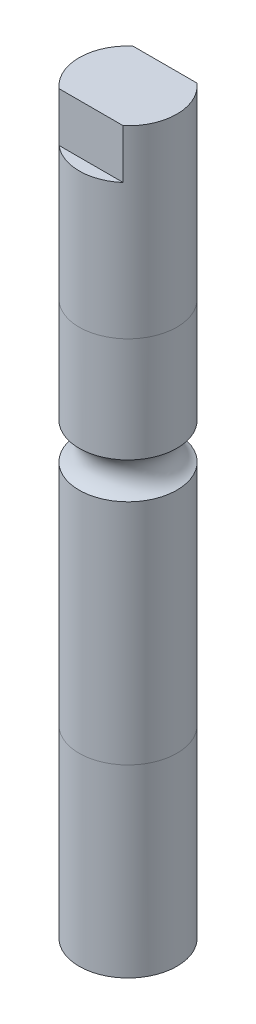
ISO-10303-21;
HEADER;
FILE_DESCRIPTION(('STEP AP214'),'2;1');
FILE_NAME('part.step','',(''),(''),'','','');
FILE_SCHEMA(('AUTOMOTIVE_DESIGN { 1 0 10303 214 1 1 1 1 }'));
ENDSEC;
DATA;
#1=APPLICATION_CONTEXT('core data for automotive mechanical design processes');
#2=APPLICATION_PROTOCOL_DEFINITION('international standard','automotive_design',2000,#1);
#3=PRODUCT_CONTEXT('',#1,'mechanical');
#4=PRODUCT('Part','Part','',(#3));
#5=PRODUCT_RELATED_PRODUCT_CATEGORY('part','',(#4));
#6=PRODUCT_DEFINITION_FORMATION('','',#4);
#7=PRODUCT_DEFINITION_CONTEXT('part definition',#1,'design');
#8=PRODUCT_DEFINITION('design','',#6,#7);
#9=PRODUCT_DEFINITION_SHAPE('','',#8);
#10=(LENGTH_UNIT() NAMED_UNIT(*) SI_UNIT(.MILLI.,.METRE.));
#11=(NAMED_UNIT(*) PLANE_ANGLE_UNIT() SI_UNIT($,.RADIAN.));
#12=(NAMED_UNIT(*) SI_UNIT($,.STERADIAN.) SOLID_ANGLE_UNIT());
#13=UNCERTAINTY_MEASURE_WITH_UNIT(LENGTH_MEASURE(1.E-05),#10,'distance_accuracy_value','');
#14=(GEOMETRIC_REPRESENTATION_CONTEXT(3) GLOBAL_UNCERTAINTY_ASSIGNED_CONTEXT((#13)) GLOBAL_UNIT_ASSIGNED_CONTEXT((#10,
#11,#12)) REPRESENTATION_CONTEXT('',''));
#15=CARTESIAN_POINT('',(0.,0.,0.));
#16=DIRECTION('',(0.,0.,1.));
#17=DIRECTION('',(1.,0.,0.));
#18=AXIS2_PLACEMENT_3D('',#15,#16,#17);
#19=CARTESIAN_POINT('',(0.,60.,0.));
#20=DIRECTION('',(0.,-1.,0.));
#21=DIRECTION('',(0.,0.,-1.));
#22=AXIS2_PLACEMENT_3D('',#19,#20,#21);
#23=CYLINDRICAL_SURFACE('',#22,3.975);
#24=CARTESIAN_POINT('',(0.,33.5271201678345,0.));
#25=DIRECTION('',(0.,-1.,0.));
#26=DIRECTION('',(0.,0.,-1.));
#27=AXIS2_PLACEMENT_3D('',#24,#25,#26);
#28=CIRCLE('',#27,3.975);
#29=CARTESIAN_POINT('',(0.,33.5271201678345,-3.975));
#30=VERTEX_POINT('',#29);
#31=EDGE_CURVE('E113',#30,#30,#28,.T.);
#32=ORIENTED_EDGE('',*,*,#31,.T.);
#33=EDGE_LOOP('',(#32));
#34=FACE_BOUND('',#33,.T.);
#35=CARTESIAN_POINT('',(0.,15.,0.));
#36=DIRECTION('',(0.,-1.,0.));
#37=DIRECTION('',(0.,0.,-1.));
#38=AXIS2_PLACEMENT_3D('',#35,#36,#37);
#39=CIRCLE('',#38,3.975);
#40=CARTESIAN_POINT('',(0.,15.,-3.975));
#41=VERTEX_POINT('',#40);
#42=EDGE_CURVE('E12',#41,#41,#39,.T.);
#43=ORIENTED_EDGE('',*,*,#42,.F.);
#44=EDGE_LOOP('',(#43));
#45=FACE_BOUND('',#44,.T.);
#46=ADVANCED_FACE('F39',(#34,#45),#23,.T.);
#47=CARTESIAN_POINT('',(0.,0.,0.));
#48=DIRECTION('',(0.,1.,0.));
#49=DIRECTION('',(0.,0.,1.));
#50=AXIS2_PLACEMENT_3D('',#47,#48,#49);
#51=CIRCLE('',#50,3.975);
#52=CARTESIAN_POINT('',(0.,0.,3.975));
#53=VERTEX_POINT('',#52);
#54=EDGE_CURVE('E116',#53,#53,#51,.T.);
#55=ORIENTED_EDGE('',*,*,#54,.T.);
#56=EDGE_LOOP('',(#55));
#57=FACE_BOUND('',#56,.T.);
#58=ORIENTED_EDGE('',*,*,#42,.T.);
#59=EDGE_LOOP('',(#58));
#60=FACE_BOUND('',#59,.T.);
#61=ADVANCED_FACE('F135',(#57,#60),#23,.T.);
#62=CARTESIAN_POINT('',(0.,0.,0.));
#63=DIRECTION('',(0.,1.,0.));
#64=DIRECTION('',(0.,0.,1.));
#65=AXIS2_PLACEMENT_3D('',#62,#63,#64);
#66=PLANE('',#65);
#67=ORIENTED_EDGE('',*,*,#54,.F.);
#68=EDGE_LOOP('',(#67));
#69=FACE_BOUND('',#68,.T.);
#70=ADVANCED_FACE('F142',(#69),#66,.F.);
#71=CARTESIAN_POINT('',(0.,35.,0.));
#72=DIRECTION('',(0.,-1.,0.));
#73=DIRECTION('',(0.,0.,-1.));
#74=AXIS2_PLACEMENT_3D('',#71,#72,#73);
#75=TOROIDAL_SURFACE('',#74,4.6,1.6);
#76=ORIENTED_EDGE('',*,*,#31,.F.);
#77=EDGE_LOOP('',(#76));
#78=FACE_BOUND('',#77,.T.);
#79=CARTESIAN_POINT('',(0.,36.4728798321655,0.));
#80=DIRECTION('',(0.,-1.,0.));
#81=DIRECTION('',(0.,0.,-1.));
#82=AXIS2_PLACEMENT_3D('',#79,#80,#81);
#83=CIRCLE('',#82,3.975);
#84=CARTESIAN_POINT('',(0.,36.4728798321655,-3.975));
#85=VERTEX_POINT('',#84);
#86=EDGE_CURVE('E109',#85,#85,#83,.T.);
#87=ORIENTED_EDGE('',*,*,#86,.T.);
#88=EDGE_LOOP('',(#87));
#89=FACE_BOUND('',#88,.T.);
#90=ADVANCED_FACE('F149',(#78,#89),#75,.F.);
#91=CARTESIAN_POINT('',(0.,60.,0.));
#92=DIRECTION('',(0.,1.,0.));
#93=DIRECTION('',(0.,0.,1.));
#94=AXIS2_PLACEMENT_3D('',#91,#92,#93);
#95=PLANE('',#94);
#96=DIRECTION('',(-1.,0.,0.));
#97=VECTOR('',#96,1.);
#98=CARTESIAN_POINT('',(-2.60780079760706,60.,3.));
#99=LINE('',#98,#97);
#100=CARTESIAN_POINT('',(2.60780079760706,60.,3.));
#101=VERTEX_POINT('',#100);
#102=CARTESIAN_POINT('',(-2.60780079760706,60.,3.));
#103=VERTEX_POINT('',#102);
#104=EDGE_CURVE('E83',#101,#103,#99,.T.);
#105=ORIENTED_EDGE('',*,*,#104,.F.);
#106=CARTESIAN_POINT('',(0.,60.,0.));
#107=DIRECTION('',(0.,1.,0.));
#108=DIRECTION('',(0.,0.,1.));
#109=AXIS2_PLACEMENT_3D('',#106,#107,#108);
#110=CIRCLE('',#109,3.975);
#111=CARTESIAN_POINT('',(2.60780079760706,60.,-3.));
#112=VERTEX_POINT('',#111);
#113=EDGE_CURVE('E95',#101,#112,#110,.T.);
#114=ORIENTED_EDGE('',*,*,#113,.T.);
#115=DIRECTION('',(1.,0.,0.));
#116=VECTOR('',#115,1.);
#117=CARTESIAN_POINT('',(-2.60780079760706,60.,-3.));
#118=LINE('',#117,#116);
#119=CARTESIAN_POINT('',(-2.60780079760706,60.,-3.));
#120=VERTEX_POINT('',#119);
#121=EDGE_CURVE('E97',#120,#112,#118,.T.);
#122=ORIENTED_EDGE('',*,*,#121,.F.);
#123=EDGE_CURVE('E117',#120,#103,#110,.T.);
#124=ORIENTED_EDGE('',*,*,#123,.T.);
#125=EDGE_LOOP('',(#105,#114,#122,#124));
#126=FACE_BOUND('',#125,.T.);
#127=ADVANCED_FACE('F134',(#126),#95,.T.);
#128=ORIENTED_EDGE('',*,*,#113,.F.);
#129=DIRECTION('',(0.,1.,0.));
#130=VECTOR('',#129,1.);
#131=CARTESIAN_POINT('',(2.60780079760706,56.,3.));
#132=LINE('',#131,#130);
#133=CARTESIAN_POINT('',(2.60780079760706,56.,3.));
#134=VERTEX_POINT('',#133);
#135=EDGE_CURVE('E87',#134,#101,#132,.T.);
#136=ORIENTED_EDGE('',*,*,#135,.F.);
#137=CARTESIAN_POINT('',(0.,56.,0.));
#138=DIRECTION('',(0.,1.,0.));
#139=DIRECTION('',(0.,0.,1.));
#140=AXIS2_PLACEMENT_3D('',#137,#138,#139);
#141=CIRCLE('',#140,3.975);
#142=CARTESIAN_POINT('',(-2.60780079760706,56.,3.));
#143=VERTEX_POINT('',#142);
#144=EDGE_CURVE('E78',#143,#134,#141,.T.);
#145=ORIENTED_EDGE('',*,*,#144,.F.);
#146=DIRECTION('',(0.,1.,0.));
#147=VECTOR('',#146,1.);
#148=CARTESIAN_POINT('',(-2.60780079760706,56.,3.));
#149=LINE('',#148,#147);
#150=EDGE_CURVE('E89',#143,#103,#149,.T.);
#151=ORIENTED_EDGE('',*,*,#150,.T.);
#152=ORIENTED_EDGE('',*,*,#123,.F.);
#153=DIRECTION('',(0.,1.,0.));
#154=VECTOR('',#153,1.);
#155=CARTESIAN_POINT('',(-2.60780079760706,56.,-3.));
#156=LINE('',#155,#154);
#157=CARTESIAN_POINT('',(-2.60780079760706,56.,-3.));
#158=VERTEX_POINT('',#157);
#159=EDGE_CURVE('E104',#158,#120,#156,.T.);
#160=ORIENTED_EDGE('',*,*,#159,.F.);
#161=CARTESIAN_POINT('',(0.,56.,0.));
#162=DIRECTION('',(0.,1.,0.));
#163=DIRECTION('',(0.,0.,1.));
#164=AXIS2_PLACEMENT_3D('',#161,#162,#163);
#165=CIRCLE('',#164,3.975);
#166=CARTESIAN_POINT('',(2.60780079760706,56.,-3.));
#167=VERTEX_POINT('',#166);
#168=EDGE_CURVE('E101',#167,#158,#165,.T.);
#169=ORIENTED_EDGE('',*,*,#168,.F.);
#170=DIRECTION('',(0.,1.,0.));
#171=VECTOR('',#170,1.);
#172=CARTESIAN_POINT('',(2.60780079760706,56.,-3.));
#173=LINE('',#172,#171);
#174=EDGE_CURVE('E107',#167,#112,#173,.T.);
#175=ORIENTED_EDGE('',*,*,#174,.T.);
#176=EDGE_LOOP('',(#128,#136,#145,#151,#152,#160,#169,#175));
#177=FACE_BOUND('',#176,.T.);
#178=CARTESIAN_POINT('',(0.,45.,0.));
#179=DIRECTION('',(0.,1.,0.));
#180=DIRECTION('',(0.,0.,1.));
#181=AXIS2_PLACEMENT_3D('',#178,#179,#180);
#182=CIRCLE('',#181,3.975);
#183=CARTESIAN_POINT('',(0.,45.,3.975));
#184=VERTEX_POINT('',#183);
#185=EDGE_CURVE('E47',#184,#184,#182,.T.);
#186=ORIENTED_EDGE('',*,*,#185,.T.);
#187=EDGE_LOOP('',(#186));
#188=FACE_BOUND('',#187,.T.);
#189=ADVANCED_FACE('F92',(#177,#188),#23,.T.);
#190=ORIENTED_EDGE('',*,*,#86,.F.);
#191=EDGE_LOOP('',(#190));
#192=FACE_BOUND('',#191,.T.);
#193=ORIENTED_EDGE('',*,*,#185,.F.);
#194=EDGE_LOOP('',(#193));
#195=FACE_BOUND('',#194,.T.);
#196=ADVANCED_FACE('F41',(#192,#195),#23,.T.);
#197=CARTESIAN_POINT('',(-2.60780079760706,56.,-3.));
#198=DIRECTION('',(0.,0.,1.));
#199=DIRECTION('',(1.,0.,0.));
#200=AXIS2_PLACEMENT_3D('',#197,#198,#199);
#201=PLANE('',#200);
#202=ORIENTED_EDGE('',*,*,#121,.T.);
#203=ORIENTED_EDGE('',*,*,#174,.F.);
#204=DIRECTION('',(1.,0.,0.));
#205=VECTOR('',#204,1.);
#206=CARTESIAN_POINT('',(-2.60780079760706,56.,-3.));
#207=LINE('',#206,#205);
#208=EDGE_CURVE('E60',#158,#167,#207,.T.);
#209=ORIENTED_EDGE('',*,*,#208,.F.);
#210=ORIENTED_EDGE('',*,*,#159,.T.);
#211=EDGE_LOOP('',(#202,#203,#209,#210));
#212=FACE_BOUND('',#211,.T.);
#213=ADVANCED_FACE('F125',(#212),#201,.F.);
#214=CARTESIAN_POINT('',(0.,56.,0.));
#215=DIRECTION('',(0.,1.,0.));
#216=DIRECTION('',(0.,0.,1.));
#217=AXIS2_PLACEMENT_3D('',#214,#215,#216);
#218=PLANE('',#217);
#219=ORIENTED_EDGE('',*,*,#168,.T.);
#220=ORIENTED_EDGE('',*,*,#208,.T.);
#221=EDGE_LOOP('',(#219,#220));
#222=FACE_BOUND('',#221,.T.);
#223=ADVANCED_FACE('F131',(#222),#218,.T.);
#224=CARTESIAN_POINT('',(-2.60780079760706,56.,3.));
#225=DIRECTION('',(0.,0.,-1.));
#226=DIRECTION('',(-1.,0.,0.));
#227=AXIS2_PLACEMENT_3D('',#224,#225,#226);
#228=PLANE('',#227);
#229=ORIENTED_EDGE('',*,*,#104,.T.);
#230=ORIENTED_EDGE('',*,*,#150,.F.);
#231=DIRECTION('',(-1.,0.,0.));
#232=VECTOR('',#231,1.);
#233=CARTESIAN_POINT('',(-2.60780079760706,56.,3.));
#234=LINE('',#233,#232);
#235=EDGE_CURVE('E53',#134,#143,#234,.T.);
#236=ORIENTED_EDGE('',*,*,#235,.F.);
#237=ORIENTED_EDGE('',*,*,#135,.T.);
#238=EDGE_LOOP('',(#229,#230,#236,#237));
#239=FACE_BOUND('',#238,.T.);
#240=ADVANCED_FACE('F86',(#239),#228,.F.);
#241=CARTESIAN_POINT('',(0.,56.,0.));
#242=DIRECTION('',(0.,1.,0.));
#243=DIRECTION('',(0.,0.,1.));
#244=AXIS2_PLACEMENT_3D('',#241,#242,#243);
#245=PLANE('',#244);
#246=ORIENTED_EDGE('',*,*,#144,.T.);
#247=ORIENTED_EDGE('',*,*,#235,.T.);
#248=EDGE_LOOP('',(#246,#247));
#249=FACE_BOUND('',#248,.T.);
#250=ADVANCED_FACE('F79',(#249),#245,.T.);
#251=CLOSED_SHELL('',(#46,#61,#70,#90,#127,#189,#196,#213,#223,#240,#250));
#252=MANIFOLD_SOLID_BREP('B2',#251);
#253=ADVANCED_BREP_SHAPE_REPRESENTATION('',(#18,#252),#14);
#254=SHAPE_DEFINITION_REPRESENTATION(#9,#253);
ENDSEC;
END-ISO-10303-21;
